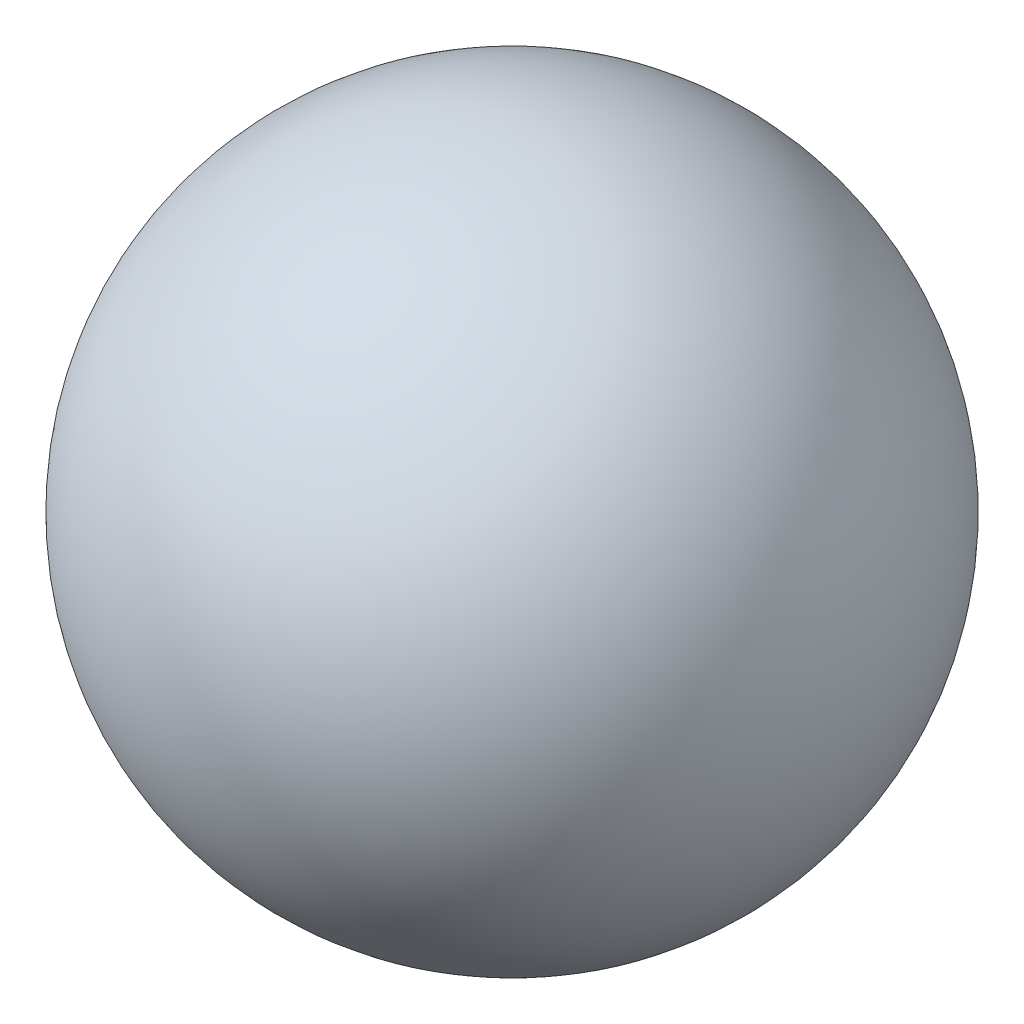
ISO-10303-21;
HEADER;
FILE_DESCRIPTION(('STEP AP214'),'2;1');
FILE_NAME('part.step','',(''),(''),'','','');
FILE_SCHEMA(('AUTOMOTIVE_DESIGN { 1 0 10303 214 1 1 1 1 }'));
ENDSEC;
DATA;
#1=APPLICATION_CONTEXT('core data for automotive mechanical design processes');
#2=APPLICATION_PROTOCOL_DEFINITION('international standard','automotive_design',2000,#1);
#3=PRODUCT_CONTEXT('',#1,'mechanical');
#4=PRODUCT('Part','Part','',(#3));
#5=PRODUCT_RELATED_PRODUCT_CATEGORY('part','',(#4));
#6=PRODUCT_DEFINITION_FORMATION('','',#4);
#7=PRODUCT_DEFINITION_CONTEXT('part definition',#1,'design');
#8=PRODUCT_DEFINITION('design','',#6,#7);
#9=PRODUCT_DEFINITION_SHAPE('','',#8);
#10=(LENGTH_UNIT() NAMED_UNIT(*) SI_UNIT(.MILLI.,.METRE.));
#11=(NAMED_UNIT(*) PLANE_ANGLE_UNIT() SI_UNIT($,.RADIAN.));
#12=(NAMED_UNIT(*) SI_UNIT($,.STERADIAN.) SOLID_ANGLE_UNIT());
#13=UNCERTAINTY_MEASURE_WITH_UNIT(LENGTH_MEASURE(1.E-05),#10,'distance_accuracy_value','');
#14=(GEOMETRIC_REPRESENTATION_CONTEXT(3) GLOBAL_UNCERTAINTY_ASSIGNED_CONTEXT((#13)) GLOBAL_UNIT_ASSIGNED_CONTEXT((#10,
#11,#12)) REPRESENTATION_CONTEXT('',''));
#15=CARTESIAN_POINT('',(0.,0.,0.));
#16=DIRECTION('',(0.,0.,1.));
#17=DIRECTION('',(1.,0.,0.));
#18=AXIS2_PLACEMENT_3D('',#15,#16,#17);
#19=CARTESIAN_POINT('',(0.,0.,0.));
#20=DIRECTION('',(0.,1.,0.));
#21=DIRECTION('',(1.,0.,0.));
#22=AXIS2_PLACEMENT_3D('',#19,#20,#21);
#23=SPHERICAL_SURFACE('',#22,1.14300000000001);
#24=CARTESIAN_POINT('',(0.,1.14300000000001,0.));
#25=VERTEX_POINT('',#24);
#26=VERTEX_LOOP('',#25);
#27=FACE_BOUND('',#26,.T.);
#28=ADVANCED_FACE('F28',(#27),#23,.T.);
#29=CLOSED_SHELL('',(#28));
#30=MANIFOLD_SOLID_BREP('B2',#29);
#31=ADVANCED_BREP_SHAPE_REPRESENTATION('',(#18,#30),#14);
#32=SHAPE_DEFINITION_REPRESENTATION(#9,#31);
ENDSEC;
END-ISO-10303-21;
